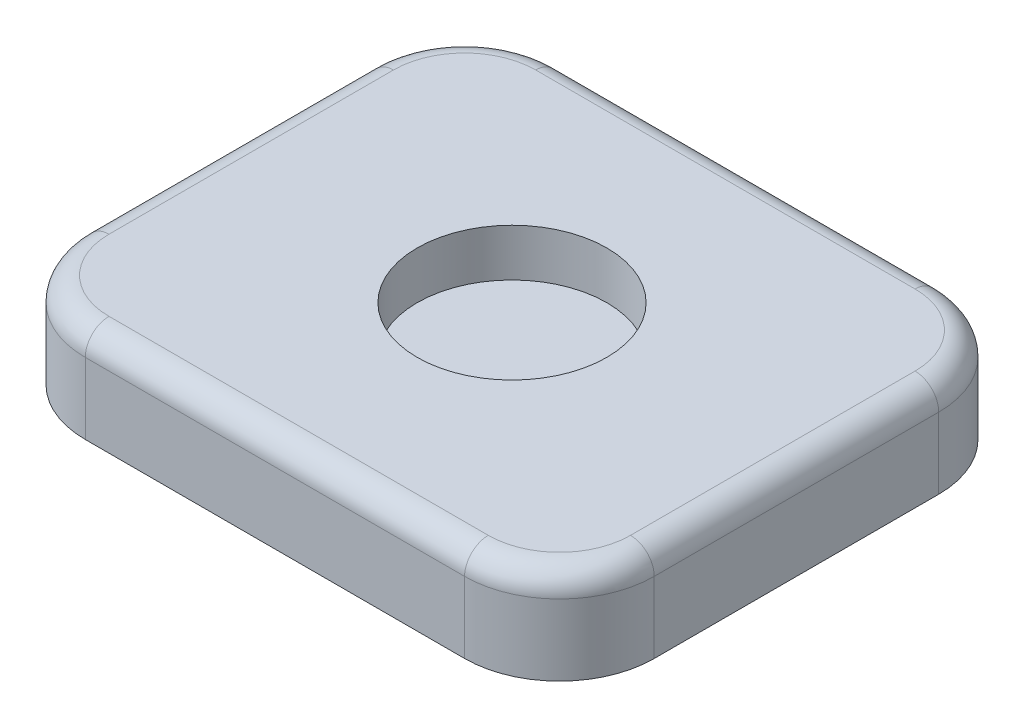
ISO-10303-21;
HEADER;
FILE_DESCRIPTION(('STEP AP214'),'2;1');
FILE_NAME('part.step','',(''),(''),'','','');
FILE_SCHEMA(('AUTOMOTIVE_DESIGN { 1 0 10303 214 1 1 1 1 }'));
ENDSEC;
DATA;
#1=APPLICATION_CONTEXT('core data for automotive mechanical design processes');
#2=APPLICATION_PROTOCOL_DEFINITION('international standard','automotive_design',2000,#1);
#3=PRODUCT_CONTEXT('',#1,'mechanical');
#4=PRODUCT('Part','Part','',(#3));
#5=PRODUCT_RELATED_PRODUCT_CATEGORY('part','',(#4));
#6=PRODUCT_DEFINITION_FORMATION('','',#4);
#7=PRODUCT_DEFINITION_CONTEXT('part definition',#1,'design');
#8=PRODUCT_DEFINITION('design','',#6,#7);
#9=PRODUCT_DEFINITION_SHAPE('','',#8);
#10=(LENGTH_UNIT() NAMED_UNIT(*) SI_UNIT(.MILLI.,.METRE.));
#11=(NAMED_UNIT(*) PLANE_ANGLE_UNIT() SI_UNIT($,.RADIAN.));
#12=(NAMED_UNIT(*) SI_UNIT($,.STERADIAN.) SOLID_ANGLE_UNIT());
#13=UNCERTAINTY_MEASURE_WITH_UNIT(LENGTH_MEASURE(1.E-05),#10,'distance_accuracy_value','');
#14=(GEOMETRIC_REPRESENTATION_CONTEXT(3) GLOBAL_UNCERTAINTY_ASSIGNED_CONTEXT((#13)) GLOBAL_UNIT_ASSIGNED_CONTEXT((#10,
#11,#12)) REPRESENTATION_CONTEXT('',''));
#15=CARTESIAN_POINT('',(0.,0.,0.));
#16=DIRECTION('',(0.,0.,1.));
#17=DIRECTION('',(1.,0.,0.));
#18=AXIS2_PLACEMENT_3D('',#15,#16,#17);
#19=CARTESIAN_POINT('',(0.,10.,0.));
#20=DIRECTION('',(0.,1.,0.));
#21=DIRECTION('',(0.,0.,1.));
#22=AXIS2_PLACEMENT_3D('',#19,#20,#21);
#23=PLANE('',#22);
#24=DIRECTION('',(1.,0.,0.));
#25=VECTOR('',#24,1.);
#26=CARTESIAN_POINT('',(40.,10.,45.));
#27=LINE('',#26,#25);
#28=CARTESIAN_POINT('',(-40.,10.,45.));
#29=VERTEX_POINT('',#28);
#30=CARTESIAN_POINT('',(40.,10.,45.));
#31=VERTEX_POINT('',#30);
#32=EDGE_CURVE('E212',#29,#31,#27,.T.);
#33=ORIENTED_EDGE('',*,*,#32,.T.);
#34=CARTESIAN_POINT('',(40.,10.,30.));
#35=DIRECTION('',(0.,1.,0.));
#36=DIRECTION('',(0.,0.,1.));
#37=AXIS2_PLACEMENT_3D('',#34,#35,#36);
#38=CIRCLE('',#37,15.);
#39=CARTESIAN_POINT('',(55.,10.,30.));
#40=VERTEX_POINT('',#39);
#41=EDGE_CURVE('E218',#31,#40,#38,.T.);
#42=ORIENTED_EDGE('',*,*,#41,.T.);
#43=DIRECTION('',(0.,0.,-1.));
#44=VECTOR('',#43,1.);
#45=CARTESIAN_POINT('',(55.,10.,-30.));
#46=LINE('',#45,#44);
#47=CARTESIAN_POINT('',(55.,10.,-30.));
#48=VERTEX_POINT('',#47);
#49=EDGE_CURVE('E215',#40,#48,#46,.T.);
#50=ORIENTED_EDGE('',*,*,#49,.T.);
#51=CARTESIAN_POINT('',(40.,10.,-30.));
#52=DIRECTION('',(0.,1.,0.));
#53=DIRECTION('',(0.,0.,1.));
#54=AXIS2_PLACEMENT_3D('',#51,#52,#53);
#55=CIRCLE('',#54,15.);
#56=CARTESIAN_POINT('',(40.,10.,-45.));
#57=VERTEX_POINT('',#56);
#58=EDGE_CURVE('E209',#48,#57,#55,.T.);
#59=ORIENTED_EDGE('',*,*,#58,.T.);
#60=DIRECTION('',(-1.,0.,0.));
#61=VECTOR('',#60,1.);
#62=CARTESIAN_POINT('',(-40.,10.,-45.));
#63=LINE('',#62,#61);
#64=CARTESIAN_POINT('',(-40.,10.,-45.));
#65=VERTEX_POINT('',#64);
#66=EDGE_CURVE('E202',#57,#65,#63,.T.);
#67=ORIENTED_EDGE('',*,*,#66,.T.);
#68=CARTESIAN_POINT('',(-40.,10.,-30.));
#69=DIRECTION('',(0.,1.,0.));
#70=DIRECTION('',(0.,0.,1.));
#71=AXIS2_PLACEMENT_3D('',#68,#69,#70);
#72=CIRCLE('',#71,15.);
#73=CARTESIAN_POINT('',(-55.,10.,-30.));
#74=VERTEX_POINT('',#73);
#75=EDGE_CURVE('E196',#65,#74,#72,.T.);
#76=ORIENTED_EDGE('',*,*,#75,.T.);
#77=DIRECTION('',(0.,0.,1.));
#78=VECTOR('',#77,1.);
#79=CARTESIAN_POINT('',(-55.,10.,30.));
#80=LINE('',#79,#78);
#81=CARTESIAN_POINT('',(-55.,10.,30.));
#82=VERTEX_POINT('',#81);
#83=EDGE_CURVE('E199',#74,#82,#80,.T.);
#84=ORIENTED_EDGE('',*,*,#83,.T.);
#85=CARTESIAN_POINT('',(-40.,10.,30.));
#86=DIRECTION('',(0.,1.,0.));
#87=DIRECTION('',(0.,0.,1.));
#88=AXIS2_PLACEMENT_3D('',#85,#86,#87);
#89=CIRCLE('',#88,15.);
#90=EDGE_CURVE('E206',#82,#29,#89,.T.);
#91=ORIENTED_EDGE('',*,*,#90,.T.);
#92=EDGE_LOOP('',(#33,#42,#50,#59,#67,#76,#84,#91));
#93=FACE_BOUND('',#92,.T.);
#94=CARTESIAN_POINT('',(0.,10.,0.));
#95=DIRECTION('',(0.,1.,0.));
#96=DIRECTION('',(0.,0.,1.));
#97=AXIS2_PLACEMENT_3D('',#94,#95,#96);
#98=CIRCLE('',#97,20.);
#99=CARTESIAN_POINT('',(0.,10.,20.));
#100=VERTEX_POINT('',#99);
#101=EDGE_CURVE('E158',#100,#100,#98,.T.);
#102=ORIENTED_EDGE('',*,*,#101,.F.);
#103=EDGE_LOOP('',(#102));
#104=FACE_BOUND('',#103,.T.);
#105=ADVANCED_FACE('F45',(#93,#104),#23,.T.);
#106=CARTESIAN_POINT('',(60.,10.,-50.));
#107=DIRECTION('',(-1.,0.,0.));
#108=DIRECTION('',(0.,0.,1.));
#109=AXIS2_PLACEMENT_3D('',#106,#107,#108);
#110=PLANE('',#109);
#111=DIRECTION('',(0.,-1.,0.));
#112=VECTOR('',#111,1.);
#113=CARTESIAN_POINT('',(60.,10.,-30.));
#114=LINE('',#113,#112);
#115=CARTESIAN_POINT('',(60.,-10.,-30.));
#116=VERTEX_POINT('',#115);
#117=CARTESIAN_POINT('',(60.,5.,-30.));
#118=VERTEX_POINT('',#117);
#119=EDGE_CURVE('E192',#116,#118,#114,.F.);
#120=ORIENTED_EDGE('',*,*,#119,.T.);
#121=DIRECTION('',(0.,0.,-1.));
#122=VECTOR('',#121,1.);
#123=CARTESIAN_POINT('',(60.,5.,30.));
#124=LINE('',#123,#122);
#125=CARTESIAN_POINT('',(60.,5.,30.));
#126=VERTEX_POINT('',#125);
#127=EDGE_CURVE('E225',#118,#126,#124,.F.);
#128=ORIENTED_EDGE('',*,*,#127,.T.);
#129=DIRECTION('',(0.,-1.,0.));
#130=VECTOR('',#129,1.);
#131=CARTESIAN_POINT('',(60.,10.,30.));
#132=LINE('',#131,#130);
#133=CARTESIAN_POINT('',(60.,-10.,30.));
#134=VERTEX_POINT('',#133);
#135=EDGE_CURVE('E189',#126,#134,#132,.T.);
#136=ORIENTED_EDGE('',*,*,#135,.T.);
#137=DIRECTION('',(0.,0.,1.));
#138=VECTOR('',#137,1.);
#139=CARTESIAN_POINT('',(60.,-10.,50.));
#140=LINE('',#139,#138);
#141=EDGE_CURVE('E290',#116,#134,#140,.T.);
#142=ORIENTED_EDGE('',*,*,#141,.F.);
#143=EDGE_LOOP('',(#120,#128,#136,#142));
#144=FACE_BOUND('',#143,.T.);
#145=ADVANCED_FACE('F289',(#144),#110,.F.);
#146=CARTESIAN_POINT('',(-60.,10.,-50.));
#147=DIRECTION('',(0.,0.,1.));
#148=DIRECTION('',(1.,0.,0.));
#149=AXIS2_PLACEMENT_3D('',#146,#147,#148);
#150=PLANE('',#149);
#151=DIRECTION('',(0.,-1.,0.));
#152=VECTOR('',#151,1.);
#153=CARTESIAN_POINT('',(-40.,10.,-50.));
#154=LINE('',#153,#152);
#155=CARTESIAN_POINT('',(-40.,-10.,-50.));
#156=VERTEX_POINT('',#155);
#157=CARTESIAN_POINT('',(-40.,5.,-50.));
#158=VERTEX_POINT('',#157);
#159=EDGE_CURVE('E178',#156,#158,#154,.F.);
#160=ORIENTED_EDGE('',*,*,#159,.T.);
#161=DIRECTION('',(-1.,0.,0.));
#162=VECTOR('',#161,1.);
#163=CARTESIAN_POINT('',(40.,5.,-50.));
#164=LINE('',#163,#162);
#165=CARTESIAN_POINT('',(40.,5.,-50.));
#166=VERTEX_POINT('',#165);
#167=EDGE_CURVE('E221',#158,#166,#164,.F.);
#168=ORIENTED_EDGE('',*,*,#167,.T.);
#169=DIRECTION('',(0.,-1.,0.));
#170=VECTOR('',#169,1.);
#171=CARTESIAN_POINT('',(40.,10.,-50.));
#172=LINE('',#171,#170);
#173=CARTESIAN_POINT('',(40.,-10.,-50.));
#174=VERTEX_POINT('',#173);
#175=EDGE_CURVE('E175',#166,#174,#172,.T.);
#176=ORIENTED_EDGE('',*,*,#175,.T.);
#177=DIRECTION('',(1.,0.,0.));
#178=VECTOR('',#177,1.);
#179=CARTESIAN_POINT('',(-60.,-10.,-50.));
#180=LINE('',#179,#178);
#181=EDGE_CURVE('E154',#156,#174,#180,.T.);
#182=ORIENTED_EDGE('',*,*,#181,.F.);
#183=EDGE_LOOP('',(#160,#168,#176,#182));
#184=FACE_BOUND('',#183,.T.);
#185=ADVANCED_FACE('F321',(#184),#150,.F.);
#186=CARTESIAN_POINT('',(-60.,10.,-50.));
#187=DIRECTION('',(1.,0.,0.));
#188=DIRECTION('',(0.,0.,-1.));
#189=AXIS2_PLACEMENT_3D('',#186,#187,#188);
#190=PLANE('',#189);
#191=DIRECTION('',(0.,-1.,0.));
#192=VECTOR('',#191,1.);
#193=CARTESIAN_POINT('',(-60.,10.,30.));
#194=LINE('',#193,#192);
#195=CARTESIAN_POINT('',(-60.,-10.,30.));
#196=VERTEX_POINT('',#195);
#197=CARTESIAN_POINT('',(-60.,5.,30.));
#198=VERTEX_POINT('',#197);
#199=EDGE_CURVE('E149',#196,#198,#194,.F.);
#200=ORIENTED_EDGE('',*,*,#199,.T.);
#201=DIRECTION('',(0.,0.,1.));
#202=VECTOR('',#201,1.);
#203=CARTESIAN_POINT('',(-60.,5.,-30.));
#204=LINE('',#203,#202);
#205=CARTESIAN_POINT('',(-60.,5.,-30.));
#206=VERTEX_POINT('',#205);
#207=EDGE_CURVE('E69',#198,#206,#204,.F.);
#208=ORIENTED_EDGE('',*,*,#207,.T.);
#209=DIRECTION('',(0.,-1.,0.));
#210=VECTOR('',#209,1.);
#211=CARTESIAN_POINT('',(-60.,10.,-30.));
#212=LINE('',#211,#210);
#213=CARTESIAN_POINT('',(-60.,-10.,-30.));
#214=VERTEX_POINT('',#213);
#215=EDGE_CURVE('E151',#206,#214,#212,.T.);
#216=ORIENTED_EDGE('',*,*,#215,.T.);
#217=DIRECTION('',(0.,0.,-1.));
#218=VECTOR('',#217,1.);
#219=CARTESIAN_POINT('',(-60.,-10.,50.));
#220=LINE('',#219,#218);
#221=EDGE_CURVE('E141',#196,#214,#220,.T.);
#222=ORIENTED_EDGE('',*,*,#221,.F.);
#223=EDGE_LOOP('',(#200,#208,#216,#222));
#224=FACE_BOUND('',#223,.T.);
#225=ADVANCED_FACE('F148',(#224),#190,.F.);
#226=CARTESIAN_POINT('',(-60.,10.,50.));
#227=DIRECTION('',(0.,0.,-1.));
#228=DIRECTION('',(-1.,0.,0.));
#229=AXIS2_PLACEMENT_3D('',#226,#227,#228);
#230=PLANE('',#229);
#231=DIRECTION('',(0.,-1.,0.));
#232=VECTOR('',#231,1.);
#233=CARTESIAN_POINT('',(40.,10.,50.));
#234=LINE('',#233,#232);
#235=CARTESIAN_POINT('',(40.,-10.,50.));
#236=VERTEX_POINT('',#235);
#237=CARTESIAN_POINT('',(40.,5.,50.));
#238=VERTEX_POINT('',#237);
#239=EDGE_CURVE('E182',#236,#238,#234,.F.);
#240=ORIENTED_EDGE('',*,*,#239,.T.);
#241=DIRECTION('',(1.,0.,0.));
#242=VECTOR('',#241,1.);
#243=CARTESIAN_POINT('',(-40.,5.,50.));
#244=LINE('',#243,#242);
#245=CARTESIAN_POINT('',(-40.,5.,50.));
#246=VERTEX_POINT('',#245);
#247=EDGE_CURVE('E228',#238,#246,#244,.F.);
#248=ORIENTED_EDGE('',*,*,#247,.T.);
#249=DIRECTION('',(0.,-1.,0.));
#250=VECTOR('',#249,1.);
#251=CARTESIAN_POINT('',(-40.,10.,50.));
#252=LINE('',#251,#250);
#253=CARTESIAN_POINT('',(-40.,-10.,50.));
#254=VERTEX_POINT('',#253);
#255=EDGE_CURVE('E186',#246,#254,#252,.T.);
#256=ORIENTED_EDGE('',*,*,#255,.T.);
#257=DIRECTION('',(-1.,0.,0.));
#258=VECTOR('',#257,1.);
#259=CARTESIAN_POINT('',(-60.,-10.,50.));
#260=LINE('',#259,#258);
#261=EDGE_CURVE('E143',#236,#254,#260,.T.);
#262=ORIENTED_EDGE('',*,*,#261,.F.);
#263=EDGE_LOOP('',(#240,#248,#256,#262));
#264=FACE_BOUND('',#263,.T.);
#265=ADVANCED_FACE('F280',(#264),#230,.F.);
#266=CARTESIAN_POINT('',(0.,10.,0.));
#267=DIRECTION('',(0.,-1.,0.));
#268=DIRECTION('',(0.,0.,-1.));
#269=AXIS2_PLACEMENT_3D('',#266,#267,#268);
#270=CYLINDRICAL_SURFACE('',#269,20.);
#271=ORIENTED_EDGE('',*,*,#101,.T.);
#272=EDGE_LOOP('',(#271));
#273=FACE_BOUND('',#272,.T.);
#274=CARTESIAN_POINT('',(0.,0.,0.));
#275=DIRECTION('',(0.,1.,0.));
#276=DIRECTION('',(0.,0.,1.));
#277=AXIS2_PLACEMENT_3D('',#274,#275,#276);
#278=CIRCLE('',#277,20.);
#279=CARTESIAN_POINT('',(0.,0.,20.));
#280=VERTEX_POINT('',#279);
#281=EDGE_CURVE('E165',#280,#280,#278,.T.);
#282=ORIENTED_EDGE('',*,*,#281,.F.);
#283=EDGE_LOOP('',(#282));
#284=FACE_BOUND('',#283,.T.);
#285=ADVANCED_FACE('F342',(#273,#284),#270,.F.);
#286=CARTESIAN_POINT('',(0.,0.,0.));
#287=DIRECTION('',(0.,-1.,0.));
#288=DIRECTION('',(0.,0.,-1.));
#289=AXIS2_PLACEMENT_3D('',#286,#287,#288);
#290=PLANE('',#289);
#291=ORIENTED_EDGE('',*,*,#281,.T.);
#292=EDGE_LOOP('',(#291));
#293=FACE_BOUND('',#292,.T.);
#294=ADVANCED_FACE('F437',(#293),#290,.F.);
#295=CARTESIAN_POINT('',(0.,-10.,0.));
#296=DIRECTION('',(0.,-1.,0.));
#297=DIRECTION('',(0.,0.,-1.));
#298=AXIS2_PLACEMENT_3D('',#295,#296,#297);
#299=PLANE('',#298);
#300=ORIENTED_EDGE('',*,*,#221,.T.);
#301=CARTESIAN_POINT('',(-40.,-10.,-30.));
#302=DIRECTION('',(0.,-1.,0.));
#303=DIRECTION('',(0.,0.,-1.));
#304=AXIS2_PLACEMENT_3D('',#301,#302,#303);
#305=CIRCLE('',#304,20.);
#306=EDGE_CURVE('E145',#214,#156,#305,.T.);
#307=ORIENTED_EDGE('',*,*,#306,.T.);
#308=ORIENTED_EDGE('',*,*,#181,.T.);
#309=CARTESIAN_POINT('',(40.,-10.,-30.));
#310=DIRECTION('',(0.,-1.,0.));
#311=DIRECTION('',(0.,0.,-1.));
#312=AXIS2_PLACEMENT_3D('',#309,#310,#311);
#313=CIRCLE('',#312,20.);
#314=EDGE_CURVE('E146',#174,#116,#313,.T.);
#315=ORIENTED_EDGE('',*,*,#314,.T.);
#316=ORIENTED_EDGE('',*,*,#141,.T.);
#317=CARTESIAN_POINT('',(40.,-10.,30.));
#318=DIRECTION('',(0.,-1.,0.));
#319=DIRECTION('',(0.,0.,-1.));
#320=AXIS2_PLACEMENT_3D('',#317,#318,#319);
#321=CIRCLE('',#320,20.);
#322=EDGE_CURVE('E162',#134,#236,#321,.T.);
#323=ORIENTED_EDGE('',*,*,#322,.T.);
#324=ORIENTED_EDGE('',*,*,#261,.T.);
#325=CARTESIAN_POINT('',(-40.,-10.,30.));
#326=DIRECTION('',(0.,-1.,0.));
#327=DIRECTION('',(0.,0.,-1.));
#328=AXIS2_PLACEMENT_3D('',#325,#326,#327);
#329=CIRCLE('',#328,20.);
#330=EDGE_CURVE('E138',#254,#196,#329,.T.);
#331=ORIENTED_EDGE('',*,*,#330,.T.);
#332=EDGE_LOOP('',(#300,#307,#308,#315,#316,#323,#324,#331));
#333=FACE_BOUND('',#332,.T.);
#334=ADVANCED_FACE('F140',(#333),#299,.T.);
#335=CARTESIAN_POINT('',(-40.,10.,-30.));
#336=DIRECTION('',(0.,-1.,0.));
#337=DIRECTION('',(0.,0.,-1.));
#338=AXIS2_PLACEMENT_3D('',#335,#336,#337);
#339=CYLINDRICAL_SURFACE('',#338,20.);
#340=ORIENTED_EDGE('',*,*,#215,.F.);
#341=CARTESIAN_POINT('',(-40.,5.,-30.));
#342=DIRECTION('',(0.,1.,0.));
#343=DIRECTION('',(0.,0.,1.));
#344=AXIS2_PLACEMENT_3D('',#341,#342,#343);
#345=CIRCLE('',#344,20.);
#346=EDGE_CURVE('E11',#206,#158,#345,.F.);
#347=ORIENTED_EDGE('',*,*,#346,.T.);
#348=ORIENTED_EDGE('',*,*,#159,.F.);
#349=ORIENTED_EDGE('',*,*,#306,.F.);
#350=EDGE_LOOP('',(#340,#347,#348,#349));
#351=FACE_BOUND('',#350,.T.);
#352=ADVANCED_FACE('F317',(#351),#339,.T.);
#353=CARTESIAN_POINT('',(-40.,10.,30.));
#354=DIRECTION('',(0.,-1.,0.));
#355=DIRECTION('',(0.,0.,-1.));
#356=AXIS2_PLACEMENT_3D('',#353,#354,#355);
#357=CYLINDRICAL_SURFACE('',#356,20.);
#358=ORIENTED_EDGE('',*,*,#255,.F.);
#359=CARTESIAN_POINT('',(-40.,5.,30.));
#360=DIRECTION('',(0.,1.,0.));
#361=DIRECTION('',(0.,0.,1.));
#362=AXIS2_PLACEMENT_3D('',#359,#360,#361);
#363=CIRCLE('',#362,20.);
#364=EDGE_CURVE('E55',#246,#198,#363,.F.);
#365=ORIENTED_EDGE('',*,*,#364,.T.);
#366=ORIENTED_EDGE('',*,*,#199,.F.);
#367=ORIENTED_EDGE('',*,*,#330,.F.);
#368=EDGE_LOOP('',(#358,#365,#366,#367));
#369=FACE_BOUND('',#368,.T.);
#370=ADVANCED_FACE('F156',(#369),#357,.T.);
#371=CARTESIAN_POINT('',(40.,10.,-30.));
#372=DIRECTION('',(0.,-1.,0.));
#373=DIRECTION('',(0.,0.,-1.));
#374=AXIS2_PLACEMENT_3D('',#371,#372,#373);
#375=CYLINDRICAL_SURFACE('',#374,20.);
#376=ORIENTED_EDGE('',*,*,#175,.F.);
#377=CARTESIAN_POINT('',(40.,5.,-30.));
#378=DIRECTION('',(0.,1.,0.));
#379=DIRECTION('',(0.,0.,1.));
#380=AXIS2_PLACEMENT_3D('',#377,#378,#379);
#381=CIRCLE('',#380,20.);
#382=EDGE_CURVE('E233',#166,#118,#381,.F.);
#383=ORIENTED_EDGE('',*,*,#382,.T.);
#384=ORIENTED_EDGE('',*,*,#119,.F.);
#385=ORIENTED_EDGE('',*,*,#314,.F.);
#386=EDGE_LOOP('',(#376,#383,#384,#385));
#387=FACE_BOUND('',#386,.T.);
#388=ADVANCED_FACE('F354',(#387),#375,.T.);
#389=CARTESIAN_POINT('',(40.,10.,30.));
#390=DIRECTION('',(0.,-1.,0.));
#391=DIRECTION('',(0.,0.,-1.));
#392=AXIS2_PLACEMENT_3D('',#389,#390,#391);
#393=CYLINDRICAL_SURFACE('',#392,20.);
#394=ORIENTED_EDGE('',*,*,#135,.F.);
#395=CARTESIAN_POINT('',(40.,5.,30.));
#396=DIRECTION('',(0.,1.,0.));
#397=DIRECTION('',(0.,0.,1.));
#398=AXIS2_PLACEMENT_3D('',#395,#396,#397);
#399=CIRCLE('',#398,20.);
#400=EDGE_CURVE('E236',#126,#238,#399,.F.);
#401=ORIENTED_EDGE('',*,*,#400,.T.);
#402=ORIENTED_EDGE('',*,*,#239,.F.);
#403=ORIENTED_EDGE('',*,*,#322,.F.);
#404=EDGE_LOOP('',(#394,#401,#402,#403));
#405=FACE_BOUND('',#404,.T.);
#406=ADVANCED_FACE('F285',(#405),#393,.T.);
#407=CARTESIAN_POINT('',(0.,5.,45.));
#408=DIRECTION('',(-1.,0.,0.));
#409=DIRECTION('',(0.,0.,1.));
#410=AXIS2_PLACEMENT_3D('',#407,#408,#409);
#411=CYLINDRICAL_SURFACE('',#410,5.);
#412=CARTESIAN_POINT('',(-40.,5.,45.));
#413=DIRECTION('',(-1.,0.,0.));
#414=DIRECTION('',(0.,0.,1.));
#415=AXIS2_PLACEMENT_3D('',#412,#413,#414);
#416=CIRCLE('',#415,5.);
#417=EDGE_CURVE('E262',#246,#29,#416,.T.);
#418=ORIENTED_EDGE('',*,*,#417,.F.);
#419=ORIENTED_EDGE('',*,*,#247,.F.);
#420=CARTESIAN_POINT('',(40.,5.,45.));
#421=DIRECTION('',(1.,0.,0.));
#422=DIRECTION('',(0.,0.,-1.));
#423=AXIS2_PLACEMENT_3D('',#420,#421,#422);
#424=CIRCLE('',#423,5.);
#425=EDGE_CURVE('E49',#31,#238,#424,.T.);
#426=ORIENTED_EDGE('',*,*,#425,.F.);
#427=ORIENTED_EDGE('',*,*,#32,.F.);
#428=EDGE_LOOP('',(#418,#419,#426,#427));
#429=FACE_BOUND('',#428,.T.);
#430=ADVANCED_FACE('F47',(#429),#411,.T.);
#431=CARTESIAN_POINT('',(40.,5.,30.));
#432=DIRECTION('',(0.,1.,0.));
#433=DIRECTION('',(0.,0.,1.));
#434=AXIS2_PLACEMENT_3D('',#431,#432,#433);
#435=TOROIDAL_SURFACE('',#434,15.,5.);
#436=ORIENTED_EDGE('',*,*,#425,.T.);
#437=ORIENTED_EDGE('',*,*,#400,.F.);
#438=CARTESIAN_POINT('',(55.,5.,30.));
#439=DIRECTION('',(0.,0.,-1.));
#440=DIRECTION('',(-1.,0.,0.));
#441=AXIS2_PLACEMENT_3D('',#438,#439,#440);
#442=CIRCLE('',#441,5.);
#443=EDGE_CURVE('E259',#40,#126,#442,.T.);
#444=ORIENTED_EDGE('',*,*,#443,.F.);
#445=ORIENTED_EDGE('',*,*,#41,.F.);
#446=EDGE_LOOP('',(#436,#437,#444,#445));
#447=FACE_BOUND('',#446,.T.);
#448=ADVANCED_FACE('F274',(#447),#435,.T.);
#449=CARTESIAN_POINT('',(-40.,5.,30.));
#450=DIRECTION('',(0.,1.,0.));
#451=DIRECTION('',(0.,0.,1.));
#452=AXIS2_PLACEMENT_3D('',#449,#450,#451);
#453=TOROIDAL_SURFACE('',#452,15.,5.);
#454=ORIENTED_EDGE('',*,*,#417,.T.);
#455=ORIENTED_EDGE('',*,*,#90,.F.);
#456=CARTESIAN_POINT('',(-55.,5.,30.));
#457=DIRECTION('',(0.,0.,-1.));
#458=DIRECTION('',(-1.,0.,0.));
#459=AXIS2_PLACEMENT_3D('',#456,#457,#458);
#460=CIRCLE('',#459,5.);
#461=EDGE_CURVE('E255',#198,#82,#460,.T.);
#462=ORIENTED_EDGE('',*,*,#461,.F.);
#463=ORIENTED_EDGE('',*,*,#364,.F.);
#464=EDGE_LOOP('',(#454,#455,#462,#463));
#465=FACE_BOUND('',#464,.T.);
#466=ADVANCED_FACE('F306',(#465),#453,.T.);
#467=CARTESIAN_POINT('',(55.,5.,0.));
#468=DIRECTION('',(0.,0.,1.));
#469=DIRECTION('',(1.,0.,0.));
#470=AXIS2_PLACEMENT_3D('',#467,#468,#469);
#471=CYLINDRICAL_SURFACE('',#470,5.);
#472=ORIENTED_EDGE('',*,*,#443,.T.);
#473=ORIENTED_EDGE('',*,*,#127,.F.);
#474=CARTESIAN_POINT('',(55.,5.,-30.));
#475=DIRECTION('',(0.,0.,-1.));
#476=DIRECTION('',(-1.,0.,0.));
#477=AXIS2_PLACEMENT_3D('',#474,#475,#476);
#478=CIRCLE('',#477,5.);
#479=EDGE_CURVE('E251',#48,#118,#478,.T.);
#480=ORIENTED_EDGE('',*,*,#479,.F.);
#481=ORIENTED_EDGE('',*,*,#49,.F.);
#482=EDGE_LOOP('',(#472,#473,#480,#481));
#483=FACE_BOUND('',#482,.T.);
#484=ADVANCED_FACE('F295',(#483),#471,.T.);
#485=CARTESIAN_POINT('',(-55.,5.,0.));
#486=DIRECTION('',(0.,0.,-1.));
#487=DIRECTION('',(-1.,0.,0.));
#488=AXIS2_PLACEMENT_3D('',#485,#486,#487);
#489=CYLINDRICAL_SURFACE('',#488,5.);
#490=ORIENTED_EDGE('',*,*,#461,.T.);
#491=ORIENTED_EDGE('',*,*,#83,.F.);
#492=CARTESIAN_POINT('',(-55.,5.,-30.));
#493=DIRECTION('',(0.,0.,-1.));
#494=DIRECTION('',(-1.,0.,0.));
#495=AXIS2_PLACEMENT_3D('',#492,#493,#494);
#496=CIRCLE('',#495,5.);
#497=EDGE_CURVE('E247',#206,#74,#496,.T.);
#498=ORIENTED_EDGE('',*,*,#497,.F.);
#499=ORIENTED_EDGE('',*,*,#207,.F.);
#500=EDGE_LOOP('',(#490,#491,#498,#499));
#501=FACE_BOUND('',#500,.T.);
#502=ADVANCED_FACE('F308',(#501),#489,.T.);
#503=CARTESIAN_POINT('',(40.,5.,-30.));
#504=DIRECTION('',(0.,1.,0.));
#505=DIRECTION('',(0.,0.,1.));
#506=AXIS2_PLACEMENT_3D('',#503,#504,#505);
#507=TOROIDAL_SURFACE('',#506,15.,5.);
#508=ORIENTED_EDGE('',*,*,#479,.T.);
#509=ORIENTED_EDGE('',*,*,#382,.F.);
#510=CARTESIAN_POINT('',(40.,5.,-45.));
#511=DIRECTION('',(-1.,0.,0.));
#512=DIRECTION('',(0.,0.,1.));
#513=AXIS2_PLACEMENT_3D('',#510,#511,#512);
#514=CIRCLE('',#513,5.);
#515=EDGE_CURVE('E244',#57,#166,#514,.T.);
#516=ORIENTED_EDGE('',*,*,#515,.F.);
#517=ORIENTED_EDGE('',*,*,#58,.F.);
#518=EDGE_LOOP('',(#508,#509,#516,#517));
#519=FACE_BOUND('',#518,.T.);
#520=ADVANCED_FACE('F300',(#519),#507,.T.);
#521=CARTESIAN_POINT('',(-40.,5.,-30.));
#522=DIRECTION('',(0.,1.,0.));
#523=DIRECTION('',(0.,0.,1.));
#524=AXIS2_PLACEMENT_3D('',#521,#522,#523);
#525=TOROIDAL_SURFACE('',#524,15.,5.);
#526=ORIENTED_EDGE('',*,*,#497,.T.);
#527=ORIENTED_EDGE('',*,*,#75,.F.);
#528=CARTESIAN_POINT('',(-40.,5.,-45.));
#529=DIRECTION('',(1.,0.,0.));
#530=DIRECTION('',(0.,0.,-1.));
#531=AXIS2_PLACEMENT_3D('',#528,#529,#530);
#532=CIRCLE('',#531,5.);
#533=EDGE_CURVE('E241',#158,#65,#532,.T.);
#534=ORIENTED_EDGE('',*,*,#533,.F.);
#535=ORIENTED_EDGE('',*,*,#346,.F.);
#536=EDGE_LOOP('',(#526,#527,#534,#535));
#537=FACE_BOUND('',#536,.T.);
#538=ADVANCED_FACE('F314',(#537),#525,.T.);
#539=CARTESIAN_POINT('',(0.,5.,-45.));
#540=DIRECTION('',(1.,0.,0.));
#541=DIRECTION('',(0.,0.,-1.));
#542=AXIS2_PLACEMENT_3D('',#539,#540,#541);
#543=CYLINDRICAL_SURFACE('',#542,5.);
#544=ORIENTED_EDGE('',*,*,#515,.T.);
#545=ORIENTED_EDGE('',*,*,#167,.F.);
#546=ORIENTED_EDGE('',*,*,#533,.T.);
#547=ORIENTED_EDGE('',*,*,#66,.F.);
#548=EDGE_LOOP('',(#544,#545,#546,#547));
#549=FACE_BOUND('',#548,.T.);
#550=ADVANCED_FACE('F325',(#549),#543,.T.);
#551=CLOSED_SHELL('',(#105,#145,#185,#225,#265,#285,#294,#334,#352,#370,#388,#406,#430,#448,
#466,#484,#502,#520,#538,#550));
#552=MANIFOLD_SOLID_BREP('B2',#551);
#553=ADVANCED_BREP_SHAPE_REPRESENTATION('',(#18,#552),#14);
#554=SHAPE_DEFINITION_REPRESENTATION(#9,#553);
ENDSEC;
END-ISO-10303-21;
